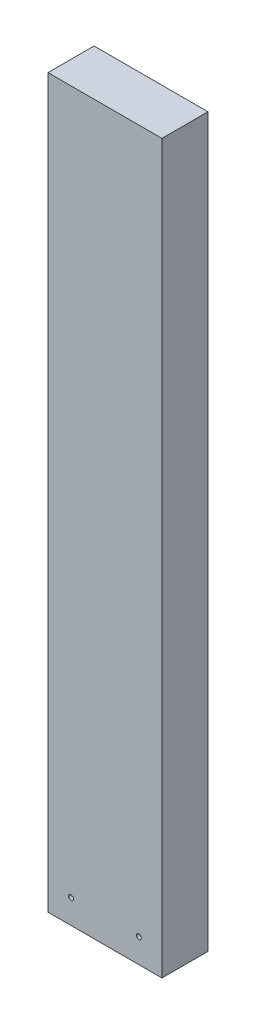
ISO-10303-21;
HEADER;
FILE_DESCRIPTION(('STEP AP214'),'2;1');
FILE_NAME('part.step','',(''),(''),'','','');
FILE_SCHEMA(('AUTOMOTIVE_DESIGN { 1 0 10303 214 1 1 1 1 }'));
ENDSEC;
DATA;
#1=APPLICATION_CONTEXT('core data for automotive mechanical design processes');
#2=APPLICATION_PROTOCOL_DEFINITION('international standard','automotive_design',2000,#1);
#3=PRODUCT_CONTEXT('',#1,'mechanical');
#4=PRODUCT('Part','Part','',(#3));
#5=PRODUCT_RELATED_PRODUCT_CATEGORY('part','',(#4));
#6=PRODUCT_DEFINITION_FORMATION('','',#4);
#7=PRODUCT_DEFINITION_CONTEXT('part definition',#1,'design');
#8=PRODUCT_DEFINITION('design','',#6,#7);
#9=PRODUCT_DEFINITION_SHAPE('','',#8);
#10=(LENGTH_UNIT() NAMED_UNIT(*) SI_UNIT(.MILLI.,.METRE.));
#11=(NAMED_UNIT(*) PLANE_ANGLE_UNIT() SI_UNIT($,.RADIAN.));
#12=(NAMED_UNIT(*) SI_UNIT($,.STERADIAN.) SOLID_ANGLE_UNIT());
#13=UNCERTAINTY_MEASURE_WITH_UNIT(LENGTH_MEASURE(1.E-05),#10,'distance_accuracy_value','');
#14=(GEOMETRIC_REPRESENTATION_CONTEXT(3) GLOBAL_UNCERTAINTY_ASSIGNED_CONTEXT((#13)) GLOBAL_UNIT_ASSIGNED_CONTEXT((#10,
#11,#12)) REPRESENTATION_CONTEXT('',''));
#15=CARTESIAN_POINT('',(0.,0.,0.));
#16=DIRECTION('',(0.,0.,1.));
#17=DIRECTION('',(1.,0.,0.));
#18=AXIS2_PLACEMENT_3D('',#15,#16,#17);
#19=CARTESIAN_POINT('',(0.,0.,19.));
#20=DIRECTION('',(0.,0.,1.));
#21=DIRECTION('',(1.,0.,0.));
#22=AXIS2_PLACEMENT_3D('',#19,#20,#21);
#23=PLANE('',#22);
#24=CARTESIAN_POINT('',(-14.,-140.,19.));
#25=DIRECTION('',(0.,0.,1.));
#26=DIRECTION('',(1.,0.,0.));
#27=AXIS2_PLACEMENT_3D('',#24,#25,#26);
#28=CIRCLE('',#27,1.);
#29=CARTESIAN_POINT('',(-13.,-140.,19.));
#30=VERTEX_POINT('',#29);
#31=EDGE_CURVE('E100',#30,#30,#28,.T.);
#32=ORIENTED_EDGE('',*,*,#31,.F.);
#33=EDGE_LOOP('',(#32));
#34=FACE_BOUND('',#33,.T.);
#35=DIRECTION('',(0.,-1.,0.));
#36=VECTOR('',#35,1.);
#37=CARTESIAN_POINT('',(-23.5,150.,19.));
#38=LINE('',#37,#36);
#39=CARTESIAN_POINT('',(-23.5,150.,19.));
#40=VERTEX_POINT('',#39);
#41=CARTESIAN_POINT('',(-23.5,-150.,19.));
#42=VERTEX_POINT('',#41);
#43=EDGE_CURVE('E85',#40,#42,#38,.T.);
#44=ORIENTED_EDGE('',*,*,#43,.T.);
#45=DIRECTION('',(1.,0.,0.));
#46=VECTOR('',#45,1.);
#47=CARTESIAN_POINT('',(-23.5,-150.,19.));
#48=LINE('',#47,#46);
#49=CARTESIAN_POINT('',(23.5,-150.,19.));
#50=VERTEX_POINT('',#49);
#51=EDGE_CURVE('E80',#42,#50,#48,.T.);
#52=ORIENTED_EDGE('',*,*,#51,.T.);
#53=DIRECTION('',(0.,1.,0.));
#54=VECTOR('',#53,1.);
#55=CARTESIAN_POINT('',(23.5,150.,19.));
#56=LINE('',#55,#54);
#57=CARTESIAN_POINT('',(23.5,150.,19.));
#58=VERTEX_POINT('',#57);
#59=EDGE_CURVE('E83',#50,#58,#56,.T.);
#60=ORIENTED_EDGE('',*,*,#59,.T.);
#61=DIRECTION('',(-1.,0.,0.));
#62=VECTOR('',#61,1.);
#63=CARTESIAN_POINT('',(-23.5,150.,19.));
#64=LINE('',#63,#62);
#65=EDGE_CURVE('E50',#58,#40,#64,.T.);
#66=ORIENTED_EDGE('',*,*,#65,.T.);
#67=EDGE_LOOP('',(#44,#52,#60,#66));
#68=FACE_BOUND('',#67,.T.);
#69=CARTESIAN_POINT('',(14.,-140.,19.));
#70=DIRECTION('',(0.,0.,1.));
#71=DIRECTION('',(1.,0.,0.));
#72=AXIS2_PLACEMENT_3D('',#69,#70,#71);
#73=CIRCLE('',#72,1.);
#74=CARTESIAN_POINT('',(15.,-140.,19.));
#75=VERTEX_POINT('',#74);
#76=EDGE_CURVE('E115',#75,#75,#73,.T.);
#77=ORIENTED_EDGE('',*,*,#76,.F.);
#78=EDGE_LOOP('',(#77));
#79=FACE_BOUND('',#78,.T.);
#80=ADVANCED_FACE('F33',(#34,#68,#79),#23,.T.);
#81=CARTESIAN_POINT('',(0.,0.,0.));
#82=DIRECTION('',(0.,0.,1.));
#83=DIRECTION('',(1.,0.,0.));
#84=AXIS2_PLACEMENT_3D('',#81,#82,#83);
#85=PLANE('',#84);
#86=CARTESIAN_POINT('',(-14.,-140.,0.));
#87=DIRECTION('',(0.,0.,1.));
#88=DIRECTION('',(1.,0.,0.));
#89=AXIS2_PLACEMENT_3D('',#86,#87,#88);
#90=CIRCLE('',#89,1.);
#91=CARTESIAN_POINT('',(-13.,-140.,0.));
#92=VERTEX_POINT('',#91);
#93=EDGE_CURVE('E112',#92,#92,#90,.T.);
#94=ORIENTED_EDGE('',*,*,#93,.T.);
#95=EDGE_LOOP('',(#94));
#96=FACE_BOUND('',#95,.T.);
#97=DIRECTION('',(0.,-1.,0.));
#98=VECTOR('',#97,1.);
#99=CARTESIAN_POINT('',(-23.5,150.,0.));
#100=LINE('',#99,#98);
#101=CARTESIAN_POINT('',(-23.5,150.,0.));
#102=VERTEX_POINT('',#101);
#103=CARTESIAN_POINT('',(-23.5,-150.,0.));
#104=VERTEX_POINT('',#103);
#105=EDGE_CURVE('E97',#102,#104,#100,.T.);
#106=ORIENTED_EDGE('',*,*,#105,.F.);
#107=DIRECTION('',(-1.,0.,0.));
#108=VECTOR('',#107,1.);
#109=CARTESIAN_POINT('',(-23.5,150.,0.));
#110=LINE('',#109,#108);
#111=CARTESIAN_POINT('',(23.5,150.,0.));
#112=VERTEX_POINT('',#111);
#113=EDGE_CURVE('E73',#112,#102,#110,.T.);
#114=ORIENTED_EDGE('',*,*,#113,.F.);
#115=DIRECTION('',(0.,1.,0.));
#116=VECTOR('',#115,1.);
#117=CARTESIAN_POINT('',(23.5,150.,0.));
#118=LINE('',#117,#116);
#119=CARTESIAN_POINT('',(23.5,-150.,0.));
#120=VERTEX_POINT('',#119);
#121=EDGE_CURVE('E67',#120,#112,#118,.T.);
#122=ORIENTED_EDGE('',*,*,#121,.F.);
#123=DIRECTION('',(1.,0.,0.));
#124=VECTOR('',#123,1.);
#125=CARTESIAN_POINT('',(-23.5,-150.,0.));
#126=LINE('',#125,#124);
#127=EDGE_CURVE('E89',#104,#120,#126,.T.);
#128=ORIENTED_EDGE('',*,*,#127,.F.);
#129=EDGE_LOOP('',(#106,#114,#122,#128));
#130=FACE_BOUND('',#129,.T.);
#131=CARTESIAN_POINT('',(14.,-140.,0.));
#132=DIRECTION('',(0.,0.,1.));
#133=DIRECTION('',(1.,0.,0.));
#134=AXIS2_PLACEMENT_3D('',#131,#132,#133);
#135=CIRCLE('',#134,1.);
#136=CARTESIAN_POINT('',(15.,-140.,0.));
#137=VERTEX_POINT('',#136);
#138=EDGE_CURVE('E118',#137,#137,#135,.T.);
#139=ORIENTED_EDGE('',*,*,#138,.T.);
#140=EDGE_LOOP('',(#139));
#141=FACE_BOUND('',#140,.T.);
#142=ADVANCED_FACE('F108',(#96,#130,#141),#85,.F.);
#143=CARTESIAN_POINT('',(-23.5,150.,19.));
#144=DIRECTION('',(1.,0.,0.));
#145=DIRECTION('',(0.,0.,-1.));
#146=AXIS2_PLACEMENT_3D('',#143,#144,#145);
#147=PLANE('',#146);
#148=ORIENTED_EDGE('',*,*,#105,.T.);
#149=DIRECTION('',(0.,0.,-1.));
#150=VECTOR('',#149,1.);
#151=CARTESIAN_POINT('',(-23.5,-150.,19.));
#152=LINE('',#151,#150);
#153=EDGE_CURVE('E11',#42,#104,#152,.T.);
#154=ORIENTED_EDGE('',*,*,#153,.F.);
#155=ORIENTED_EDGE('',*,*,#43,.F.);
#156=DIRECTION('',(0.,0.,-1.));
#157=VECTOR('',#156,1.);
#158=CARTESIAN_POINT('',(-23.5,150.,19.));
#159=LINE('',#158,#157);
#160=EDGE_CURVE('E93',#40,#102,#159,.T.);
#161=ORIENTED_EDGE('',*,*,#160,.T.);
#162=EDGE_LOOP('',(#148,#154,#155,#161));
#163=FACE_BOUND('',#162,.T.);
#164=ADVANCED_FACE('F35',(#163),#147,.F.);
#165=CARTESIAN_POINT('',(-23.5,-150.,19.));
#166=DIRECTION('',(0.,1.,0.));
#167=DIRECTION('',(0.,0.,1.));
#168=AXIS2_PLACEMENT_3D('',#165,#166,#167);
#169=PLANE('',#168);
#170=ORIENTED_EDGE('',*,*,#127,.T.);
#171=DIRECTION('',(0.,0.,-1.));
#172=VECTOR('',#171,1.);
#173=CARTESIAN_POINT('',(23.5,-150.,19.));
#174=LINE('',#173,#172);
#175=EDGE_CURVE('E42',#50,#120,#174,.T.);
#176=ORIENTED_EDGE('',*,*,#175,.F.);
#177=ORIENTED_EDGE('',*,*,#51,.F.);
#178=ORIENTED_EDGE('',*,*,#153,.T.);
#179=EDGE_LOOP('',(#170,#176,#177,#178));
#180=FACE_BOUND('',#179,.T.);
#181=ADVANCED_FACE('F88',(#180),#169,.F.);
#182=CARTESIAN_POINT('',(23.5,150.,19.));
#183=DIRECTION('',(-1.,0.,0.));
#184=DIRECTION('',(0.,0.,1.));
#185=AXIS2_PLACEMENT_3D('',#182,#183,#184);
#186=PLANE('',#185);
#187=ORIENTED_EDGE('',*,*,#121,.T.);
#188=DIRECTION('',(0.,0.,-1.));
#189=VECTOR('',#188,1.);
#190=CARTESIAN_POINT('',(23.5,150.,19.));
#191=LINE('',#190,#189);
#192=EDGE_CURVE('E90',#58,#112,#191,.T.);
#193=ORIENTED_EDGE('',*,*,#192,.F.);
#194=ORIENTED_EDGE('',*,*,#59,.F.);
#195=ORIENTED_EDGE('',*,*,#175,.T.);
#196=EDGE_LOOP('',(#187,#193,#194,#195));
#197=FACE_BOUND('',#196,.T.);
#198=ADVANCED_FACE('F91',(#197),#186,.F.);
#199=CARTESIAN_POINT('',(-23.5,150.,19.));
#200=DIRECTION('',(0.,-1.,0.));
#201=DIRECTION('',(0.,0.,-1.));
#202=AXIS2_PLACEMENT_3D('',#199,#200,#201);
#203=PLANE('',#202);
#204=ORIENTED_EDGE('',*,*,#113,.T.);
#205=ORIENTED_EDGE('',*,*,#160,.F.);
#206=ORIENTED_EDGE('',*,*,#65,.F.);
#207=ORIENTED_EDGE('',*,*,#192,.T.);
#208=EDGE_LOOP('',(#204,#205,#206,#207));
#209=FACE_BOUND('',#208,.T.);
#210=ADVANCED_FACE('F105',(#209),#203,.F.);
#211=CARTESIAN_POINT('',(-14.,-140.,19.));
#212=DIRECTION('',(0.,0.,-1.));
#213=DIRECTION('',(-1.,0.,0.));
#214=AXIS2_PLACEMENT_3D('',#211,#212,#213);
#215=CYLINDRICAL_SURFACE('',#214,1.);
#216=ORIENTED_EDGE('',*,*,#31,.T.);
#217=EDGE_LOOP('',(#216));
#218=FACE_BOUND('',#217,.T.);
#219=ORIENTED_EDGE('',*,*,#93,.F.);
#220=EDGE_LOOP('',(#219));
#221=FACE_BOUND('',#220,.T.);
#222=ADVANCED_FACE('F136',(#218,#221),#215,.F.);
#223=CARTESIAN_POINT('',(14.,-140.,19.));
#224=DIRECTION('',(0.,0.,-1.));
#225=DIRECTION('',(-1.,0.,0.));
#226=AXIS2_PLACEMENT_3D('',#223,#224,#225);
#227=CYLINDRICAL_SURFACE('',#226,1.);
#228=ORIENTED_EDGE('',*,*,#76,.T.);
#229=EDGE_LOOP('',(#228));
#230=FACE_BOUND('',#229,.T.);
#231=ORIENTED_EDGE('',*,*,#138,.F.);
#232=EDGE_LOOP('',(#231));
#233=FACE_BOUND('',#232,.T.);
#234=ADVANCED_FACE('F124',(#230,#233),#227,.F.);
#235=CLOSED_SHELL('',(#80,#142,#164,#181,#198,#210,#222,#234));
#236=MANIFOLD_SOLID_BREP('B2',#235);
#237=ADVANCED_BREP_SHAPE_REPRESENTATION('',(#18,#236),#14);
#238=SHAPE_DEFINITION_REPRESENTATION(#9,#237);
ENDSEC;
END-ISO-10303-21;
